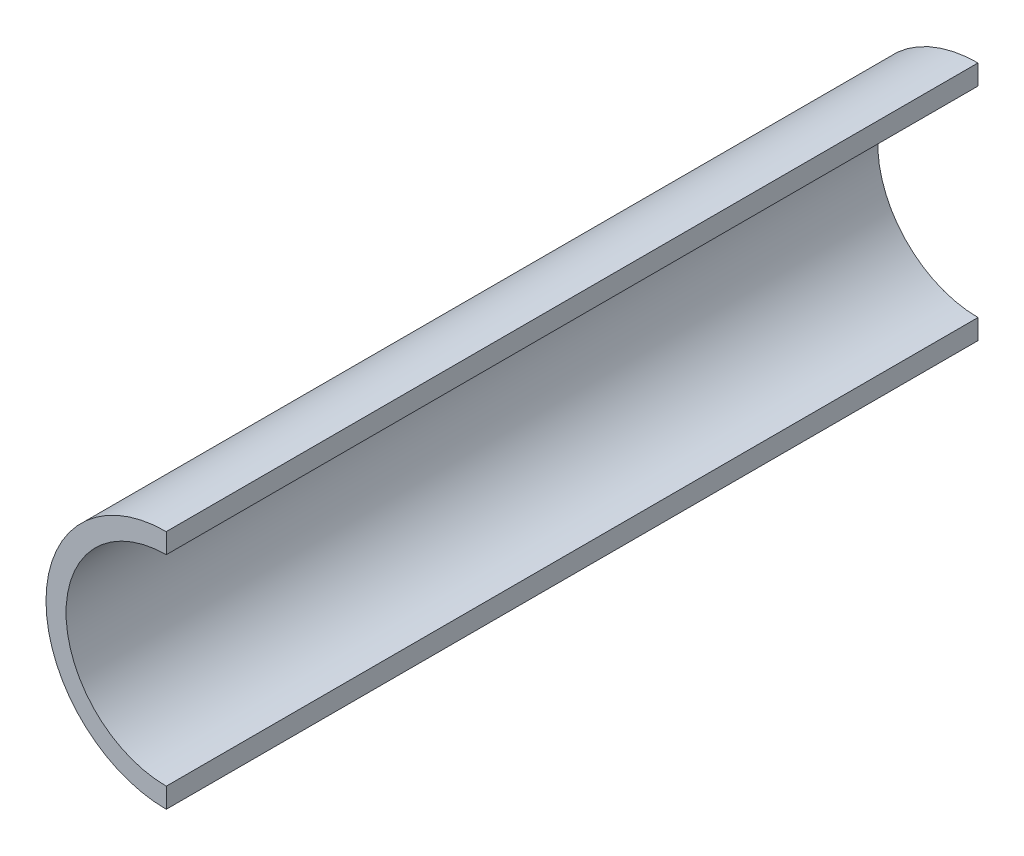
ISO-10303-21;
HEADER;
FILE_DESCRIPTION(('STEP AP214'),'2;1');
FILE_NAME('part.step','',(''),(''),'','','');
FILE_SCHEMA(('AUTOMOTIVE_DESIGN { 1 0 10303 214 1 1 1 1 }'));
ENDSEC;
DATA;
#1=APPLICATION_CONTEXT('core data for automotive mechanical design processes');
#2=APPLICATION_PROTOCOL_DEFINITION('international standard','automotive_design',2000,#1);
#3=PRODUCT_CONTEXT('',#1,'mechanical');
#4=PRODUCT('Part','Part','',(#3));
#5=PRODUCT_RELATED_PRODUCT_CATEGORY('part','',(#4));
#6=PRODUCT_DEFINITION_FORMATION('','',#4);
#7=PRODUCT_DEFINITION_CONTEXT('part definition',#1,'design');
#8=PRODUCT_DEFINITION('design','',#6,#7);
#9=PRODUCT_DEFINITION_SHAPE('','',#8);
#10=(LENGTH_UNIT() NAMED_UNIT(*) SI_UNIT(.MILLI.,.METRE.));
#11=(NAMED_UNIT(*) PLANE_ANGLE_UNIT() SI_UNIT($,.RADIAN.));
#12=(NAMED_UNIT(*) SI_UNIT($,.STERADIAN.) SOLID_ANGLE_UNIT());
#13=UNCERTAINTY_MEASURE_WITH_UNIT(LENGTH_MEASURE(1.E-05),#10,'distance_accuracy_value','');
#14=(GEOMETRIC_REPRESENTATION_CONTEXT(3) GLOBAL_UNCERTAINTY_ASSIGNED_CONTEXT((#13)) GLOBAL_UNIT_ASSIGNED_CONTEXT((#10,
#11,#12)) REPRESENTATION_CONTEXT('',''));
#15=CARTESIAN_POINT('',(0.,0.,0.));
#16=DIRECTION('',(0.,0.,1.));
#17=DIRECTION('',(1.,0.,0.));
#18=AXIS2_PLACEMENT_3D('',#15,#16,#17);
#19=CARTESIAN_POINT('',(0.,0.,64.29502));
#20=DIRECTION('',(0.,0.,-1.));
#21=DIRECTION('',(-1.,0.,0.));
#22=AXIS2_PLACEMENT_3D('',#19,#20,#21);
#23=CYLINDRICAL_SURFACE('',#22,7.9375);
#24=CARTESIAN_POINT('',(0.,0.,0.));
#25=DIRECTION('',(0.,0.,-1.));
#26=DIRECTION('',(1.,0.,0.));
#27=AXIS2_PLACEMENT_3D('',#24,#25,#26);
#28=CIRCLE('',#27,7.9375);
#29=CARTESIAN_POINT('',(0.,-7.9375,0.));
#30=VERTEX_POINT('',#29);
#31=CARTESIAN_POINT('',(0.,7.9375,0.));
#32=VERTEX_POINT('',#31);
#33=EDGE_CURVE('E93',#30,#32,#28,.T.);
#34=ORIENTED_EDGE('',*,*,#33,.T.);
#35=DIRECTION('',(0.,0.,-1.));
#36=VECTOR('',#35,1.);
#37=CARTESIAN_POINT('',(0.,7.9375,64.29502));
#38=LINE('',#37,#36);
#39=CARTESIAN_POINT('',(0.,7.9375,64.29502));
#40=VERTEX_POINT('',#39);
#41=EDGE_CURVE('E11',#40,#32,#38,.T.);
#42=ORIENTED_EDGE('',*,*,#41,.F.);
#43=CARTESIAN_POINT('',(0.,0.,64.29502));
#44=DIRECTION('',(0.,0.,-1.));
#45=DIRECTION('',(1.,0.,0.));
#46=AXIS2_PLACEMENT_3D('',#43,#44,#45);
#47=CIRCLE('',#46,7.9375);
#48=CARTESIAN_POINT('',(0.,-7.9375,64.29502));
#49=VERTEX_POINT('',#48);
#50=EDGE_CURVE('E81',#49,#40,#47,.T.);
#51=ORIENTED_EDGE('',*,*,#50,.F.);
#52=DIRECTION('',(0.,0.,-1.));
#53=VECTOR('',#52,1.);
#54=CARTESIAN_POINT('',(0.,-7.9375,64.29502));
#55=LINE('',#54,#53);
#56=EDGE_CURVE('E89',#49,#30,#55,.T.);
#57=ORIENTED_EDGE('',*,*,#56,.T.);
#58=EDGE_LOOP('',(#34,#42,#51,#57));
#59=FACE_BOUND('',#58,.T.);
#60=ADVANCED_FACE('F30',(#59),#23,.F.);
#61=CARTESIAN_POINT('',(0.,9.525,64.29502));
#62=DIRECTION('',(-1.,0.,0.));
#63=DIRECTION('',(0.,0.,1.));
#64=AXIS2_PLACEMENT_3D('',#61,#62,#63);
#65=PLANE('',#64);
#66=DIRECTION('',(0.,1.,0.));
#67=VECTOR('',#66,1.);
#68=CARTESIAN_POINT('',(0.,9.525,0.));
#69=LINE('',#68,#67);
#70=CARTESIAN_POINT('',(0.,9.525,0.));
#71=VERTEX_POINT('',#70);
#72=EDGE_CURVE('E85',#32,#71,#69,.T.);
#73=ORIENTED_EDGE('',*,*,#72,.T.);
#74=DIRECTION('',(0.,0.,-1.));
#75=VECTOR('',#74,1.);
#76=CARTESIAN_POINT('',(0.,9.525,64.29502));
#77=LINE('',#76,#75);
#78=CARTESIAN_POINT('',(0.,9.525,64.29502));
#79=VERTEX_POINT('',#78);
#80=EDGE_CURVE('E38',#79,#71,#77,.T.);
#81=ORIENTED_EDGE('',*,*,#80,.F.);
#82=DIRECTION('',(0.,1.,0.));
#83=VECTOR('',#82,1.);
#84=CARTESIAN_POINT('',(0.,9.525,64.29502));
#85=LINE('',#84,#83);
#86=EDGE_CURVE('E76',#40,#79,#85,.T.);
#87=ORIENTED_EDGE('',*,*,#86,.F.);
#88=ORIENTED_EDGE('',*,*,#41,.T.);
#89=EDGE_LOOP('',(#73,#81,#87,#88));
#90=FACE_BOUND('',#89,.T.);
#91=ADVANCED_FACE('F84',(#90),#65,.F.);
#92=CARTESIAN_POINT('',(0.,0.,64.29502));
#93=DIRECTION('',(0.,0.,-1.));
#94=DIRECTION('',(-1.,0.,0.));
#95=AXIS2_PLACEMENT_3D('',#92,#93,#94);
#96=CYLINDRICAL_SURFACE('',#95,9.525);
#97=CARTESIAN_POINT('',(0.,0.,0.));
#98=DIRECTION('',(0.,0.,1.));
#99=DIRECTION('',(1.,0.,0.));
#100=AXIS2_PLACEMENT_3D('',#97,#98,#99);
#101=CIRCLE('',#100,9.525);
#102=CARTESIAN_POINT('',(0.,-9.525,0.));
#103=VERTEX_POINT('',#102);
#104=EDGE_CURVE('E63',#71,#103,#101,.T.);
#105=ORIENTED_EDGE('',*,*,#104,.T.);
#106=DIRECTION('',(0.,0.,-1.));
#107=VECTOR('',#106,1.);
#108=CARTESIAN_POINT('',(0.,-9.525,64.29502));
#109=LINE('',#108,#107);
#110=CARTESIAN_POINT('',(0.,-9.525,64.29502));
#111=VERTEX_POINT('',#110);
#112=EDGE_CURVE('E86',#111,#103,#109,.T.);
#113=ORIENTED_EDGE('',*,*,#112,.F.);
#114=CARTESIAN_POINT('',(0.,0.,64.29502));
#115=DIRECTION('',(0.,0.,1.));
#116=DIRECTION('',(1.,0.,0.));
#117=AXIS2_PLACEMENT_3D('',#114,#115,#116);
#118=CIRCLE('',#117,9.525);
#119=EDGE_CURVE('E79',#79,#111,#118,.T.);
#120=ORIENTED_EDGE('',*,*,#119,.F.);
#121=ORIENTED_EDGE('',*,*,#80,.T.);
#122=EDGE_LOOP('',(#105,#113,#120,#121));
#123=FACE_BOUND('',#122,.T.);
#124=ADVANCED_FACE('F87',(#123),#96,.T.);
#125=CARTESIAN_POINT('',(0.,-7.9375,64.29502));
#126=DIRECTION('',(-1.,0.,0.));
#127=DIRECTION('',(0.,0.,1.));
#128=AXIS2_PLACEMENT_3D('',#125,#126,#127);
#129=PLANE('',#128);
#130=DIRECTION('',(0.,1.,0.));
#131=VECTOR('',#130,1.);
#132=CARTESIAN_POINT('',(0.,-7.9375,0.));
#133=LINE('',#132,#131);
#134=EDGE_CURVE('E69',#103,#30,#133,.T.);
#135=ORIENTED_EDGE('',*,*,#134,.T.);
#136=ORIENTED_EDGE('',*,*,#56,.F.);
#137=DIRECTION('',(0.,1.,0.));
#138=VECTOR('',#137,1.);
#139=CARTESIAN_POINT('',(0.,-7.9375,64.29502));
#140=LINE('',#139,#138);
#141=EDGE_CURVE('E46',#111,#49,#140,.T.);
#142=ORIENTED_EDGE('',*,*,#141,.F.);
#143=ORIENTED_EDGE('',*,*,#112,.T.);
#144=EDGE_LOOP('',(#135,#136,#142,#143));
#145=FACE_BOUND('',#144,.T.);
#146=ADVANCED_FACE('F100',(#145),#129,.F.);
#147=CARTESIAN_POINT('',(0.,0.,64.29502));
#148=DIRECTION('',(0.,0.,1.));
#149=DIRECTION('',(1.,0.,0.));
#150=AXIS2_PLACEMENT_3D('',#147,#148,#149);
#151=PLANE('',#150);
#152=ORIENTED_EDGE('',*,*,#50,.T.);
#153=ORIENTED_EDGE('',*,*,#86,.T.);
#154=ORIENTED_EDGE('',*,*,#119,.T.);
#155=ORIENTED_EDGE('',*,*,#141,.T.);
#156=EDGE_LOOP('',(#152,#153,#154,#155));
#157=FACE_BOUND('',#156,.T.);
#158=ADVANCED_FACE('F77',(#157),#151,.T.);
#159=CARTESIAN_POINT('',(0.,0.,0.));
#160=DIRECTION('',(0.,0.,1.));
#161=DIRECTION('',(1.,0.,0.));
#162=AXIS2_PLACEMENT_3D('',#159,#160,#161);
#163=PLANE('',#162);
#164=ORIENTED_EDGE('',*,*,#33,.F.);
#165=ORIENTED_EDGE('',*,*,#134,.F.);
#166=ORIENTED_EDGE('',*,*,#104,.F.);
#167=ORIENTED_EDGE('',*,*,#72,.F.);
#168=EDGE_LOOP('',(#164,#165,#166,#167));
#169=FACE_BOUND('',#168,.T.);
#170=ADVANCED_FACE('F103',(#169),#163,.F.);
#171=CLOSED_SHELL('',(#60,#91,#124,#146,#158,#170));
#172=MANIFOLD_SOLID_BREP('B2',#171);
#173=ADVANCED_BREP_SHAPE_REPRESENTATION('',(#18,#172),#14);
#174=SHAPE_DEFINITION_REPRESENTATION(#9,#173);
ENDSEC;
END-ISO-10303-21;
